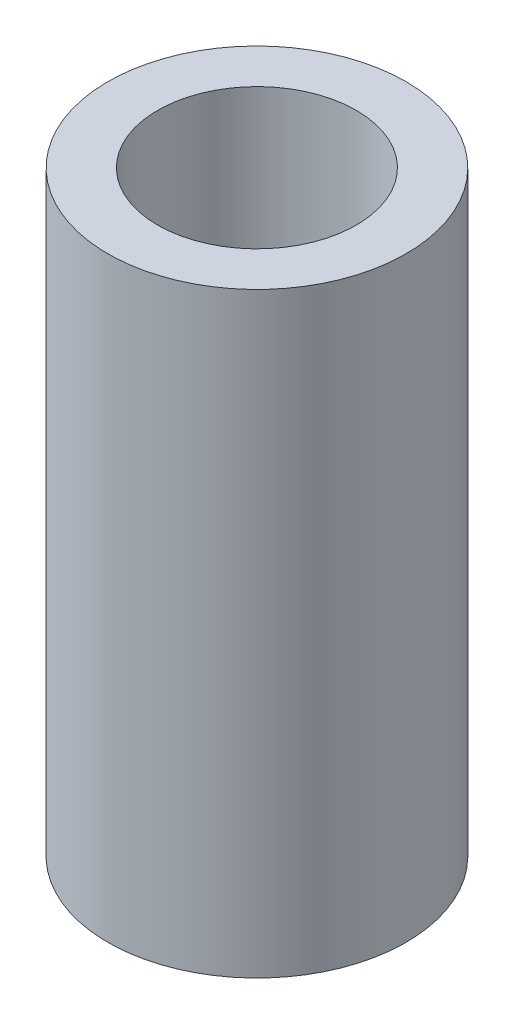
ISO-10303-21;
HEADER;
FILE_DESCRIPTION(('STEP AP214'),'2;1');
FILE_NAME('part.step','',(''),(''),'','','');
FILE_SCHEMA(('AUTOMOTIVE_DESIGN { 1 0 10303 214 1 1 1 1 }'));
ENDSEC;
DATA;
#1=APPLICATION_CONTEXT('core data for automotive mechanical design processes');
#2=APPLICATION_PROTOCOL_DEFINITION('international standard','automotive_design',2000,#1);
#3=PRODUCT_CONTEXT('',#1,'mechanical');
#4=PRODUCT('Part','Part','',(#3));
#5=PRODUCT_RELATED_PRODUCT_CATEGORY('part','',(#4));
#6=PRODUCT_DEFINITION_FORMATION('','',#4);
#7=PRODUCT_DEFINITION_CONTEXT('part definition',#1,'design');
#8=PRODUCT_DEFINITION('design','',#6,#7);
#9=PRODUCT_DEFINITION_SHAPE('','',#8);
#10=(LENGTH_UNIT() NAMED_UNIT(*) SI_UNIT(.MILLI.,.METRE.));
#11=(NAMED_UNIT(*) PLANE_ANGLE_UNIT() SI_UNIT($,.RADIAN.));
#12=(NAMED_UNIT(*) SI_UNIT($,.STERADIAN.) SOLID_ANGLE_UNIT());
#13=UNCERTAINTY_MEASURE_WITH_UNIT(LENGTH_MEASURE(1.E-05),#10,'distance_accuracy_value','');
#14=(GEOMETRIC_REPRESENTATION_CONTEXT(3) GLOBAL_UNCERTAINTY_ASSIGNED_CONTEXT((#13)) GLOBAL_UNIT_ASSIGNED_CONTEXT((#10,
#11,#12)) REPRESENTATION_CONTEXT('',''));
#15=CARTESIAN_POINT('',(0.,0.,0.));
#16=DIRECTION('',(0.,0.,1.));
#17=DIRECTION('',(1.,0.,0.));
#18=AXIS2_PLACEMENT_3D('',#15,#16,#17);
#19=CARTESIAN_POINT('',(0.,9.525,0.));
#20=DIRECTION('',(0.,1.,0.));
#21=DIRECTION('',(0.,0.,1.));
#22=AXIS2_PLACEMENT_3D('',#19,#20,#21);
#23=PLANE('',#22);
#24=CARTESIAN_POINT('',(0.,9.525,0.));
#25=DIRECTION('',(0.,1.,0.));
#26=DIRECTION('',(0.,0.,1.));
#27=AXIS2_PLACEMENT_3D('',#24,#25,#26);
#28=CIRCLE('',#27,2.38125);
#29=CARTESIAN_POINT('',(0.,9.525,-2.38125));
#30=VERTEX_POINT('',#29);
#31=EDGE_CURVE('E10',#30,#30,#28,.T.);
#32=ORIENTED_EDGE('',*,*,#31,.T.);
#33=EDGE_LOOP('',(#32));
#34=FACE_BOUND('',#33,.T.);
#35=CARTESIAN_POINT('',(0.,9.525,0.));
#36=DIRECTION('',(0.,1.,0.));
#37=DIRECTION('',(0.,0.,1.));
#38=AXIS2_PLACEMENT_3D('',#35,#36,#37);
#39=CIRCLE('',#38,1.5875);
#40=CARTESIAN_POINT('',(0.,9.525,-1.5875));
#41=VERTEX_POINT('',#40);
#42=EDGE_CURVE('E42',#41,#41,#39,.T.);
#43=ORIENTED_EDGE('',*,*,#42,.F.);
#44=EDGE_LOOP('',(#43));
#45=FACE_BOUND('',#44,.T.);
#46=ADVANCED_FACE('F31',(#34,#45),#23,.T.);
#47=CARTESIAN_POINT('',(0.,0.,0.));
#48=DIRECTION('',(0.,1.,0.));
#49=DIRECTION('',(0.,0.,1.));
#50=AXIS2_PLACEMENT_3D('',#47,#48,#49);
#51=PLANE('',#50);
#52=CARTESIAN_POINT('',(0.,0.,0.));
#53=DIRECTION('',(0.,1.,0.));
#54=DIRECTION('',(0.,0.,1.));
#55=AXIS2_PLACEMENT_3D('',#52,#53,#54);
#56=CIRCLE('',#55,2.38125);
#57=CARTESIAN_POINT('',(0.,0.,-2.38125));
#58=VERTEX_POINT('',#57);
#59=EDGE_CURVE('E35',#58,#58,#56,.T.);
#60=ORIENTED_EDGE('',*,*,#59,.F.);
#61=EDGE_LOOP('',(#60));
#62=FACE_BOUND('',#61,.T.);
#63=CARTESIAN_POINT('',(0.,0.,0.));
#64=DIRECTION('',(0.,1.,0.));
#65=DIRECTION('',(0.,0.,1.));
#66=AXIS2_PLACEMENT_3D('',#63,#64,#65);
#67=CIRCLE('',#66,1.5875);
#68=CARTESIAN_POINT('',(0.,0.,-1.5875));
#69=VERTEX_POINT('',#68);
#70=EDGE_CURVE('E44',#69,#69,#67,.T.);
#71=ORIENTED_EDGE('',*,*,#70,.T.);
#72=EDGE_LOOP('',(#71));
#73=FACE_BOUND('',#72,.T.);
#74=ADVANCED_FACE('F54',(#62,#73),#51,.F.);
#75=CARTESIAN_POINT('',(0.,9.525,0.));
#76=DIRECTION('',(0.,-1.,0.));
#77=DIRECTION('',(0.,0.,-1.));
#78=AXIS2_PLACEMENT_3D('',#75,#76,#77);
#79=CYLINDRICAL_SURFACE('',#78,2.38125);
#80=CARTESIAN_POINT('',(0.,9.525,-2.38125));
#81=CARTESIAN_POINT('',(0.,9.42578125,-2.38125));
#82=CARTESIAN_POINT('',(0.,9.3265625,-2.38125));
#83=CARTESIAN_POINT('',(0.,9.128125,-2.38125));
#84=CARTESIAN_POINT('',(0.,9.02890625,-2.38125));
#85=CARTESIAN_POINT('',(0.,8.83046875,-2.38125));
#86=CARTESIAN_POINT('',(0.,8.73125,-2.38125));
#87=CARTESIAN_POINT('',(0.,8.5328125,-2.38125));
#88=CARTESIAN_POINT('',(0.,8.43359375,-2.38125));
#89=CARTESIAN_POINT('',(0.,8.23515625,-2.38125));
#90=CARTESIAN_POINT('',(0.,8.1359375,-2.38125));
#91=CARTESIAN_POINT('',(0.,7.9375,-2.38125));
#92=CARTESIAN_POINT('',(0.,7.83828125,-2.38125));
#93=CARTESIAN_POINT('',(0.,7.63984375,-2.38125));
#94=CARTESIAN_POINT('',(0.,7.540625,-2.38125));
#95=CARTESIAN_POINT('',(0.,7.3421875,-2.38125));
#96=CARTESIAN_POINT('',(0.,7.24296875,-2.38125));
#97=CARTESIAN_POINT('',(0.,7.04453125,-2.38125));
#98=CARTESIAN_POINT('',(0.,6.9453125,-2.38125));
#99=CARTESIAN_POINT('',(0.,6.746875,-2.38125));
#100=CARTESIAN_POINT('',(0.,6.64765625,-2.38125));
#101=CARTESIAN_POINT('',(0.,6.44921875,-2.38125));
#102=CARTESIAN_POINT('',(0.,6.35,-2.38125));
#103=CARTESIAN_POINT('',(0.,6.1515625,-2.38125));
#104=CARTESIAN_POINT('',(0.,6.05234375,-2.38125));
#105=CARTESIAN_POINT('',(0.,5.85390625,-2.38125));
#106=CARTESIAN_POINT('',(0.,5.7546875,-2.38125));
#107=CARTESIAN_POINT('',(0.,5.55625,-2.38125));
#108=CARTESIAN_POINT('',(0.,5.45703125,-2.38125));
#109=CARTESIAN_POINT('',(0.,5.25859375,-2.38125));
#110=CARTESIAN_POINT('',(0.,5.159375,-2.38125));
#111=CARTESIAN_POINT('',(0.,4.9609375,-2.38125));
#112=CARTESIAN_POINT('',(0.,4.86171875,-2.38125));
#113=CARTESIAN_POINT('',(0.,4.66328125,-2.38125));
#114=CARTESIAN_POINT('',(0.,4.5640625,-2.38125));
#115=CARTESIAN_POINT('',(0.,4.365625,-2.38125));
#116=CARTESIAN_POINT('',(0.,4.26640625,-2.38125));
#117=CARTESIAN_POINT('',(0.,4.06796875,-2.38125));
#118=CARTESIAN_POINT('',(0.,3.96875,-2.38125));
#119=CARTESIAN_POINT('',(0.,3.7703125,-2.38125));
#120=CARTESIAN_POINT('',(0.,3.67109375,-2.38125));
#121=CARTESIAN_POINT('',(0.,3.47265625,-2.38125));
#122=CARTESIAN_POINT('',(0.,3.3734375,-2.38125));
#123=CARTESIAN_POINT('',(0.,3.175,-2.38125));
#124=CARTESIAN_POINT('',(0.,3.07578125,-2.38125));
#125=CARTESIAN_POINT('',(0.,2.87734375,-2.38125));
#126=CARTESIAN_POINT('',(0.,2.778125,-2.38125));
#127=CARTESIAN_POINT('',(0.,2.5796875,-2.38125));
#128=CARTESIAN_POINT('',(0.,2.48046875,-2.38125));
#129=CARTESIAN_POINT('',(0.,2.28203125,-2.38125));
#130=CARTESIAN_POINT('',(0.,2.1828125,-2.38125));
#131=CARTESIAN_POINT('',(0.,1.984375,-2.38125));
#132=CARTESIAN_POINT('',(0.,1.88515625,-2.38125));
#133=CARTESIAN_POINT('',(0.,1.68671875,-2.38125));
#134=CARTESIAN_POINT('',(0.,1.5875,-2.38125));
#135=CARTESIAN_POINT('',(0.,1.3890625,-2.38125));
#136=CARTESIAN_POINT('',(0.,1.28984375,-2.38125));
#137=CARTESIAN_POINT('',(0.,1.09140625,-2.38125));
#138=CARTESIAN_POINT('',(0.,0.992187500000001,-2.38125));
#139=CARTESIAN_POINT('',(0.,0.793750000000001,-2.38125));
#140=CARTESIAN_POINT('',(0.,0.69453125,-2.38125));
#141=CARTESIAN_POINT('',(0.,0.49609375,-2.38125));
#142=CARTESIAN_POINT('',(0.,0.396875,-2.38125));
#143=CARTESIAN_POINT('',(0.,0.1984375,-2.38125));
#144=CARTESIAN_POINT('',(0.,0.0992187500000001,-2.38125));
#145=CARTESIAN_POINT('',(0.,0.,-2.38125));
#146=B_SPLINE_CURVE_WITH_KNOTS('',3,(#80,#81,#82,#83,#84,#85,#86,#87,#88,#89,#90,#91,#92,#93,
#94,#95,#96,#97,#98,#99,#100,#101,#102,#103,#104,#105,#106,#107,#108,#109,#110,#111,#112,#113,
#114,#115,#116,#117,#118,#119,#120,#121,#122,#123,#124,#125,#126,#127,#128,#129,#130,#131,#132,
#133,#134,#135,#136,#137,#138,#139,#140,#141,#142,#143,#144,#145),.UNSPECIFIED.,.F.,.F.,(4,2,2,
2,2,2,2,2,2,2,2,2,2,2,2,2,2,2,2,2,2,2,2,2,2,2,2,2,2,2,2,2,4),(0.,0.29765625,0.5953125,
0.892968750000001,1.190625,1.48828125,1.7859375,2.08359375,2.38125,2.67890625,2.9765625,
3.27421875,3.571875,3.86953125,4.1671875,4.46484375,4.7625,5.06015625,5.3578125,5.65546875,
5.953125,6.25078125,6.5484375,6.84609375,7.14375,7.44140625,7.7390625,8.03671875,8.334375,
8.63203125,8.9296875,9.22734375,9.525),.UNSPECIFIED.);
#147=EDGE_CURVE('BSEAM33',#30,#58,#146,.T.);
#148=ORIENTED_EDGE('',*,*,#31,.F.);
#149=ORIENTED_EDGE('',*,*,#59,.T.);
#150=ORIENTED_EDGE('',*,*,#147,.T.);
#151=ORIENTED_EDGE('',*,*,#147,.F.);
#152=EDGE_LOOP('',(#148,#150,#149,#151));
#153=FACE_BOUND('',#152,.T.);
#154=ADVANCED_FACE('F33',(#153),#79,.T.);
#155=CARTESIAN_POINT('',(0.,9.525,0.));
#156=DIRECTION('',(0.,-1.,0.));
#157=DIRECTION('',(0.,0.,-1.));
#158=AXIS2_PLACEMENT_3D('',#155,#156,#157);
#159=CYLINDRICAL_SURFACE('',#158,1.5875);
#160=CARTESIAN_POINT('',(0.,9.525,-1.5875));
#161=CARTESIAN_POINT('',(0.,9.42578125,-1.5875));
#162=CARTESIAN_POINT('',(0.,9.3265625,-1.5875));
#163=CARTESIAN_POINT('',(0.,9.128125,-1.5875));
#164=CARTESIAN_POINT('',(0.,9.02890625,-1.5875));
#165=CARTESIAN_POINT('',(0.,8.83046875,-1.5875));
#166=CARTESIAN_POINT('',(0.,8.73125,-1.5875));
#167=CARTESIAN_POINT('',(0.,8.5328125,-1.5875));
#168=CARTESIAN_POINT('',(0.,8.43359375,-1.5875));
#169=CARTESIAN_POINT('',(0.,8.23515625,-1.5875));
#170=CARTESIAN_POINT('',(0.,8.1359375,-1.5875));
#171=CARTESIAN_POINT('',(0.,7.9375,-1.5875));
#172=CARTESIAN_POINT('',(0.,7.83828125,-1.5875));
#173=CARTESIAN_POINT('',(0.,7.63984375,-1.5875));
#174=CARTESIAN_POINT('',(0.,7.540625,-1.5875));
#175=CARTESIAN_POINT('',(0.,7.3421875,-1.5875));
#176=CARTESIAN_POINT('',(0.,7.24296875,-1.5875));
#177=CARTESIAN_POINT('',(0.,7.04453125,-1.5875));
#178=CARTESIAN_POINT('',(0.,6.9453125,-1.5875));
#179=CARTESIAN_POINT('',(0.,6.746875,-1.5875));
#180=CARTESIAN_POINT('',(0.,6.64765625,-1.5875));
#181=CARTESIAN_POINT('',(0.,6.44921875,-1.5875));
#182=CARTESIAN_POINT('',(0.,6.35,-1.5875));
#183=CARTESIAN_POINT('',(0.,6.1515625,-1.5875));
#184=CARTESIAN_POINT('',(0.,6.05234375,-1.5875));
#185=CARTESIAN_POINT('',(0.,5.85390625,-1.5875));
#186=CARTESIAN_POINT('',(0.,5.7546875,-1.5875));
#187=CARTESIAN_POINT('',(0.,5.55625,-1.5875));
#188=CARTESIAN_POINT('',(0.,5.45703125,-1.5875));
#189=CARTESIAN_POINT('',(0.,5.25859375,-1.5875));
#190=CARTESIAN_POINT('',(0.,5.159375,-1.5875));
#191=CARTESIAN_POINT('',(0.,4.9609375,-1.5875));
#192=CARTESIAN_POINT('',(0.,4.86171875,-1.5875));
#193=CARTESIAN_POINT('',(0.,4.66328125,-1.5875));
#194=CARTESIAN_POINT('',(0.,4.5640625,-1.5875));
#195=CARTESIAN_POINT('',(0.,4.365625,-1.5875));
#196=CARTESIAN_POINT('',(0.,4.26640625,-1.5875));
#197=CARTESIAN_POINT('',(0.,4.06796875,-1.5875));
#198=CARTESIAN_POINT('',(0.,3.96875,-1.5875));
#199=CARTESIAN_POINT('',(0.,3.7703125,-1.5875));
#200=CARTESIAN_POINT('',(0.,3.67109375,-1.5875));
#201=CARTESIAN_POINT('',(0.,3.47265625,-1.5875));
#202=CARTESIAN_POINT('',(0.,3.3734375,-1.5875));
#203=CARTESIAN_POINT('',(0.,3.175,-1.5875));
#204=CARTESIAN_POINT('',(0.,3.07578125,-1.5875));
#205=CARTESIAN_POINT('',(0.,2.87734375,-1.5875));
#206=CARTESIAN_POINT('',(0.,2.778125,-1.5875));
#207=CARTESIAN_POINT('',(0.,2.5796875,-1.5875));
#208=CARTESIAN_POINT('',(0.,2.48046875,-1.5875));
#209=CARTESIAN_POINT('',(0.,2.28203125,-1.5875));
#210=CARTESIAN_POINT('',(0.,2.1828125,-1.5875));
#211=CARTESIAN_POINT('',(0.,1.984375,-1.5875));
#212=CARTESIAN_POINT('',(0.,1.88515625,-1.5875));
#213=CARTESIAN_POINT('',(0.,1.68671875,-1.5875));
#214=CARTESIAN_POINT('',(0.,1.5875,-1.5875));
#215=CARTESIAN_POINT('',(0.,1.3890625,-1.5875));
#216=CARTESIAN_POINT('',(0.,1.28984375,-1.5875));
#217=CARTESIAN_POINT('',(0.,1.09140625,-1.5875));
#218=CARTESIAN_POINT('',(0.,0.992187500000001,-1.5875));
#219=CARTESIAN_POINT('',(0.,0.793750000000001,-1.5875));
#220=CARTESIAN_POINT('',(0.,0.69453125,-1.5875));
#221=CARTESIAN_POINT('',(0.,0.49609375,-1.5875));
#222=CARTESIAN_POINT('',(0.,0.396875,-1.5875));
#223=CARTESIAN_POINT('',(0.,0.1984375,-1.5875));
#224=CARTESIAN_POINT('',(0.,0.0992187500000001,-1.5875));
#225=CARTESIAN_POINT('',(0.,0.,-1.5875));
#226=B_SPLINE_CURVE_WITH_KNOTS('',3,(#160,#161,#162,#163,#164,#165,#166,#167,#168,#169,#170,
#171,#172,#173,#174,#175,#176,#177,#178,#179,#180,#181,#182,#183,#184,#185,#186,#187,#188,#189,
#190,#191,#192,#193,#194,#195,#196,#197,#198,#199,#200,#201,#202,#203,#204,#205,#206,#207,#208,
#209,#210,#211,#212,#213,#214,#215,#216,#217,#218,#219,#220,#221,#222,#223,#224,#225),
.UNSPECIFIED.,.F.,.F.,(4,2,2,2,2,2,2,2,2,2,2,2,2,2,2,2,2,2,2,2,2,2,2,2,2,2,2,2,2,2,2,2,4),(0.,
0.297656249999998,0.595312499999999,0.892968749999999,1.190625,1.48828125,1.7859375,2.08359375,
2.38125,2.67890625,2.9765625,3.27421875,3.571875,3.86953125,4.1671875,4.46484375,4.7625,
5.06015625,5.3578125,5.65546875,5.953125,6.25078125,6.5484375,6.84609375,7.14375,7.44140625,
7.7390625,8.03671875,8.334375,8.63203125,8.9296875,9.22734375,9.525),.UNSPECIFIED.);
#227=EDGE_CURVE('BSEAM50',#41,#69,#226,.T.);
#228=ORIENTED_EDGE('',*,*,#42,.T.);
#229=ORIENTED_EDGE('',*,*,#70,.F.);
#230=ORIENTED_EDGE('',*,*,#227,.T.);
#231=ORIENTED_EDGE('',*,*,#227,.F.);
#232=EDGE_LOOP('',(#228,#230,#229,#231));
#233=FACE_BOUND('',#232,.T.);
#234=ADVANCED_FACE('F50',(#233),#159,.F.);
#235=CLOSED_SHELL('',(#46,#74,#154,#234));
#236=MANIFOLD_SOLID_BREP('B2',#235);
#237=ADVANCED_BREP_SHAPE_REPRESENTATION('',(#18,#236),#14);
#238=SHAPE_DEFINITION_REPRESENTATION(#9,#237);
ENDSEC;
END-ISO-10303-21;
